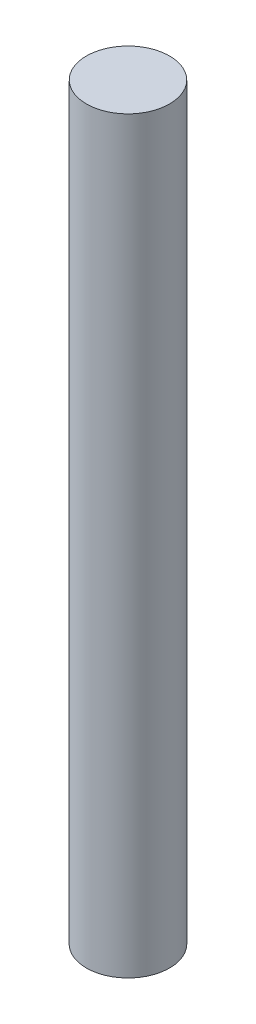
ISO-10303-21;
HEADER;
FILE_DESCRIPTION(('STEP AP214'),'2;1');
FILE_NAME('part.step','',(''),(''),'','','');
FILE_SCHEMA(('AUTOMOTIVE_DESIGN { 1 0 10303 214 1 1 1 1 }'));
ENDSEC;
DATA;
#1=APPLICATION_CONTEXT('core data for automotive mechanical design processes');
#2=APPLICATION_PROTOCOL_DEFINITION('international standard','automotive_design',2000,#1);
#3=PRODUCT_CONTEXT('',#1,'mechanical');
#4=PRODUCT('Part','Part','',(#3));
#5=PRODUCT_RELATED_PRODUCT_CATEGORY('part','',(#4));
#6=PRODUCT_DEFINITION_FORMATION('','',#4);
#7=PRODUCT_DEFINITION_CONTEXT('part definition',#1,'design');
#8=PRODUCT_DEFINITION('design','',#6,#7);
#9=PRODUCT_DEFINITION_SHAPE('','',#8);
#10=(LENGTH_UNIT() NAMED_UNIT(*) SI_UNIT(.MILLI.,.METRE.));
#11=(NAMED_UNIT(*) PLANE_ANGLE_UNIT() SI_UNIT($,.RADIAN.));
#12=(NAMED_UNIT(*) SI_UNIT($,.STERADIAN.) SOLID_ANGLE_UNIT());
#13=UNCERTAINTY_MEASURE_WITH_UNIT(LENGTH_MEASURE(1.E-05),#10,'distance_accuracy_value','');
#14=(GEOMETRIC_REPRESENTATION_CONTEXT(3) GLOBAL_UNCERTAINTY_ASSIGNED_CONTEXT((#13)) GLOBAL_UNIT_ASSIGNED_CONTEXT((#10,
#11,#12)) REPRESENTATION_CONTEXT('',''));
#15=CARTESIAN_POINT('',(0.,0.,0.));
#16=DIRECTION('',(0.,0.,1.));
#17=DIRECTION('',(1.,0.,0.));
#18=AXIS2_PLACEMENT_3D('',#15,#16,#17);
#19=CARTESIAN_POINT('',(0.,450.,0.));
#20=DIRECTION('',(0.,-1.,0.));
#21=DIRECTION('',(0.,0.,-1.));
#22=AXIS2_PLACEMENT_3D('',#19,#20,#21);
#23=CYLINDRICAL_SURFACE('',#22,25.);
#24=CARTESIAN_POINT('',(0.,450.,0.));
#25=DIRECTION('',(0.,1.,0.));
#26=DIRECTION('',(0.,0.,1.));
#27=AXIS2_PLACEMENT_3D('',#24,#25,#26);
#28=CIRCLE('',#27,25.);
#29=CARTESIAN_POINT('',(0.,450.,25.));
#30=VERTEX_POINT('',#29);
#31=EDGE_CURVE('E10',#30,#30,#28,.T.);
#32=ORIENTED_EDGE('',*,*,#31,.F.);
#33=EDGE_LOOP('',(#32));
#34=FACE_BOUND('',#33,.T.);
#35=CARTESIAN_POINT('',(0.,0.,0.));
#36=DIRECTION('',(0.,1.,0.));
#37=DIRECTION('',(0.,0.,1.));
#38=AXIS2_PLACEMENT_3D('',#35,#36,#37);
#39=CIRCLE('',#38,25.);
#40=CARTESIAN_POINT('',(0.,0.,25.));
#41=VERTEX_POINT('',#40);
#42=EDGE_CURVE('E34',#41,#41,#39,.T.);
#43=ORIENTED_EDGE('',*,*,#42,.T.);
#44=EDGE_LOOP('',(#43));
#45=FACE_BOUND('',#44,.T.);
#46=ADVANCED_FACE('F31',(#34,#45),#23,.T.);
#47=CARTESIAN_POINT('',(0.,450.,0.));
#48=DIRECTION('',(0.,1.,0.));
#49=DIRECTION('',(0.,0.,1.));
#50=AXIS2_PLACEMENT_3D('',#47,#48,#49);
#51=PLANE('',#50);
#52=ORIENTED_EDGE('',*,*,#31,.T.);
#53=EDGE_LOOP('',(#52));
#54=FACE_BOUND('',#53,.T.);
#55=ADVANCED_FACE('F46',(#54),#51,.T.);
#56=CARTESIAN_POINT('',(0.,0.,0.));
#57=DIRECTION('',(0.,1.,0.));
#58=DIRECTION('',(0.,0.,1.));
#59=AXIS2_PLACEMENT_3D('',#56,#57,#58);
#60=PLANE('',#59);
#61=ORIENTED_EDGE('',*,*,#42,.F.);
#62=EDGE_LOOP('',(#61));
#63=FACE_BOUND('',#62,.T.);
#64=ADVANCED_FACE('F44',(#63),#60,.F.);
#65=CLOSED_SHELL('',(#46,#55,#64));
#66=MANIFOLD_SOLID_BREP('B2',#65);
#67=ADVANCED_BREP_SHAPE_REPRESENTATION('',(#18,#66),#14);
#68=SHAPE_DEFINITION_REPRESENTATION(#9,#67);
ENDSEC;
END-ISO-10303-21;
